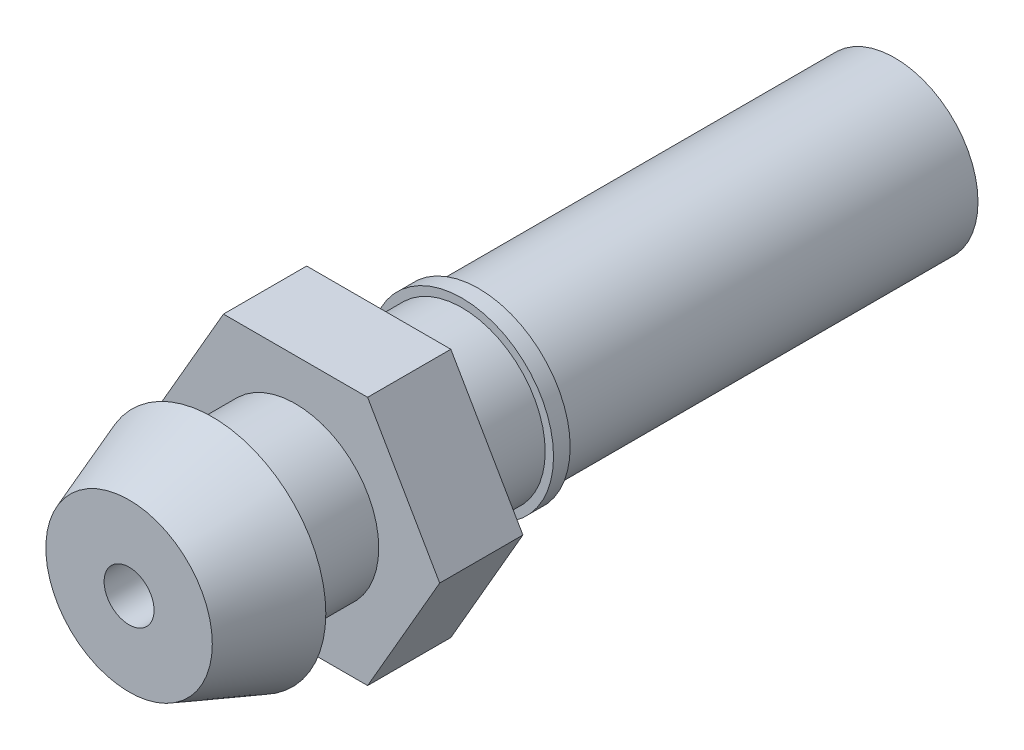
ISO-10303-21;
HEADER;
FILE_DESCRIPTION(('STEP AP214'),'2;1');
FILE_NAME('part.step','',(''),(''),'','','');
FILE_SCHEMA(('AUTOMOTIVE_DESIGN { 1 0 10303 214 1 1 1 1 }'));
ENDSEC;
DATA;
#1=APPLICATION_CONTEXT('core data for automotive mechanical design processes');
#2=APPLICATION_PROTOCOL_DEFINITION('international standard','automotive_design',2000,#1);
#3=PRODUCT_CONTEXT('',#1,'mechanical');
#4=PRODUCT('Part','Part','',(#3));
#5=PRODUCT_RELATED_PRODUCT_CATEGORY('part','',(#4));
#6=PRODUCT_DEFINITION_FORMATION('','',#4);
#7=PRODUCT_DEFINITION_CONTEXT('part definition',#1,'design');
#8=PRODUCT_DEFINITION('design','',#6,#7);
#9=PRODUCT_DEFINITION_SHAPE('','',#8);
#10=(LENGTH_UNIT() NAMED_UNIT(*) SI_UNIT(.MILLI.,.METRE.));
#11=(NAMED_UNIT(*) PLANE_ANGLE_UNIT() SI_UNIT($,.RADIAN.));
#12=(NAMED_UNIT(*) SI_UNIT($,.STERADIAN.) SOLID_ANGLE_UNIT());
#13=UNCERTAINTY_MEASURE_WITH_UNIT(LENGTH_MEASURE(1.E-05),#10,'distance_accuracy_value','');
#14=(GEOMETRIC_REPRESENTATION_CONTEXT(3) GLOBAL_UNCERTAINTY_ASSIGNED_CONTEXT((#13)) GLOBAL_UNIT_ASSIGNED_CONTEXT((#10,
#11,#12)) REPRESENTATION_CONTEXT('',''));
#15=CARTESIAN_POINT('',(0.,0.,0.));
#16=DIRECTION('',(0.,0.,1.));
#17=DIRECTION('',(1.,0.,0.));
#18=AXIS2_PLACEMENT_3D('',#15,#16,#17);
#19=CARTESIAN_POINT('',(0.,0.,11.684));
#20=DIRECTION('',(0.,0.,-1.));
#21=DIRECTION('',(1.,0.,0.));
#22=AXIS2_PLACEMENT_3D('',#19,#20,#21);
#23=CONICAL_SURFACE('',#22,1.27,0.349065850398867);
#24=CARTESIAN_POINT('',(0.,0.,11.684));
#25=DIRECTION('',(0.,0.,1.));
#26=DIRECTION('',(1.,0.,0.));
#27=AXIS2_PLACEMENT_3D('',#24,#25,#26);
#28=CIRCLE('',#27,1.27);
#29=CARTESIAN_POINT('',(1.27,0.,11.684));
#30=VERTEX_POINT('',#29);
#31=EDGE_CURVE('E11',#30,#30,#28,.T.);
#32=ORIENTED_EDGE('',*,*,#31,.F.);
#33=EDGE_LOOP('',(#32));
#34=FACE_BOUND('',#33,.T.);
#35=CARTESIAN_POINT('',(0.,0.,10.414));
#36=DIRECTION('',(0.,0.,1.));
#37=DIRECTION('',(1.,0.,0.));
#38=AXIS2_PLACEMENT_3D('',#35,#36,#37);
#39=CIRCLE('',#38,1.73224219751808);
#40=CARTESIAN_POINT('',(1.73224219751808,0.,10.414));
#41=VERTEX_POINT('',#40);
#42=EDGE_CURVE('E47',#41,#41,#39,.T.);
#43=ORIENTED_EDGE('',*,*,#42,.T.);
#44=EDGE_LOOP('',(#43));
#45=FACE_BOUND('',#44,.T.);
#46=ADVANCED_FACE('F40',(#34,#45),#23,.T.);
#47=CARTESIAN_POINT('',(0.,0.,11.684));
#48=DIRECTION('',(0.,0.,1.));
#49=DIRECTION('',(1.,0.,0.));
#50=AXIS2_PLACEMENT_3D('',#47,#48,#49);
#51=PLANE('',#50);
#52=CARTESIAN_POINT('',(0.,0.,11.684));
#53=DIRECTION('',(0.,0.,1.));
#54=DIRECTION('',(1.,0.,0.));
#55=AXIS2_PLACEMENT_3D('',#52,#53,#54);
#56=CIRCLE('',#55,0.381);
#57=CARTESIAN_POINT('',(0.381,0.,11.684));
#58=VERTEX_POINT('',#57);
#59=EDGE_CURVE('E53',#58,#58,#56,.T.);
#60=ORIENTED_EDGE('',*,*,#59,.F.);
#61=EDGE_LOOP('',(#60));
#62=FACE_BOUND('',#61,.T.);
#63=ORIENTED_EDGE('',*,*,#31,.T.);
#64=EDGE_LOOP('',(#63));
#65=FACE_BOUND('',#64,.T.);
#66=ADVANCED_FACE('F69',(#62,#65),#51,.T.);
#67=CARTESIAN_POINT('',(0.,0.,10.414));
#68=DIRECTION('',(0.,0.,1.));
#69=DIRECTION('',(1.,0.,0.));
#70=AXIS2_PLACEMENT_3D('',#67,#68,#69);
#71=PLANE('',#70);
#72=CARTESIAN_POINT('',(0.,0.,10.414));
#73=DIRECTION('',(0.,0.,1.));
#74=DIRECTION('',(1.,0.,0.));
#75=AXIS2_PLACEMENT_3D('',#72,#73,#74);
#76=CIRCLE('',#75,0.381);
#77=CARTESIAN_POINT('',(0.381,0.,10.414));
#78=VERTEX_POINT('',#77);
#79=EDGE_CURVE('E43',#78,#78,#76,.T.);
#80=ORIENTED_EDGE('',*,*,#79,.T.);
#81=EDGE_LOOP('',(#80));
#82=FACE_BOUND('',#81,.T.);
#83=ORIENTED_EDGE('',*,*,#42,.F.);
#84=EDGE_LOOP('',(#83));
#85=FACE_BOUND('',#84,.T.);
#86=ADVANCED_FACE('F60',(#82,#85),#71,.F.);
#87=CARTESIAN_POINT('',(0.,0.,0.));
#88=DIRECTION('',(0.,0.,1.));
#89=DIRECTION('',(1.,0.,0.));
#90=AXIS2_PLACEMENT_3D('',#87,#88,#89);
#91=CYLINDRICAL_SURFACE('',#90,0.381);
#92=ORIENTED_EDGE('',*,*,#59,.T.);
#93=EDGE_LOOP('',(#92));
#94=FACE_BOUND('',#93,.T.);
#95=ORIENTED_EDGE('',*,*,#79,.F.);
#96=EDGE_LOOP('',(#95));
#97=FACE_BOUND('',#96,.T.);
#98=ADVANCED_FACE('F63',(#94,#97),#91,.F.);
#99=CLOSED_SHELL('',(#46,#66,#86,#98));
#100=MANIFOLD_SOLID_BREP('B2',#99);
#101=CARTESIAN_POINT('',(0.,0.,9.144));
#102=DIRECTION('',(0.,0.,1.));
#103=DIRECTION('',(1.,0.,0.));
#104=AXIS2_PLACEMENT_3D('',#101,#102,#103);
#105=PLANE('',#104);
#106=DIRECTION('',(0.5,0.866025403784439,0.));
#107=VECTOR('',#106,1.);
#108=CARTESIAN_POINT('',(1.09985226280624,-1.905,9.144));
#109=LINE('',#108,#107);
#110=CARTESIAN_POINT('',(1.09985226280624,-1.905,9.144));
#111=VERTEX_POINT('',#110);
#112=CARTESIAN_POINT('',(2.19970452561247,0.,9.144));
#113=VERTEX_POINT('',#112);
#114=EDGE_CURVE('E200',#111,#113,#109,.T.);
#115=ORIENTED_EDGE('',*,*,#114,.T.);
#116=DIRECTION('',(-0.5,0.866025403784439,0.));
#117=VECTOR('',#116,1.);
#118=CARTESIAN_POINT('',(2.19970452561247,0.,9.144));
#119=LINE('',#118,#117);
#120=CARTESIAN_POINT('',(1.09985226280624,1.905,9.144));
#121=VERTEX_POINT('',#120);
#122=EDGE_CURVE('E158',#113,#121,#119,.T.);
#123=ORIENTED_EDGE('',*,*,#122,.T.);
#124=DIRECTION('',(-1.,0.,0.));
#125=VECTOR('',#124,1.);
#126=CARTESIAN_POINT('',(1.09985226280624,1.905,9.144));
#127=LINE('',#126,#125);
#128=CARTESIAN_POINT('',(-1.09985226280624,1.905,9.144));
#129=VERTEX_POINT('',#128);
#130=EDGE_CURVE('E171',#121,#129,#127,.T.);
#131=ORIENTED_EDGE('',*,*,#130,.T.);
#132=DIRECTION('',(-0.5,-0.866025403784439,0.));
#133=VECTOR('',#132,1.);
#134=CARTESIAN_POINT('',(-1.09985226280624,1.905,9.144));
#135=LINE('',#134,#133);
#136=CARTESIAN_POINT('',(-2.19970452561247,0.,9.144));
#137=VERTEX_POINT('',#136);
#138=EDGE_CURVE('E165',#129,#137,#135,.T.);
#139=ORIENTED_EDGE('',*,*,#138,.T.);
#140=DIRECTION('',(0.5,-0.866025403784439,0.));
#141=VECTOR('',#140,1.);
#142=CARTESIAN_POINT('',(-2.19970452561247,0.,9.144));
#143=LINE('',#142,#141);
#144=CARTESIAN_POINT('',(-1.09985226280624,-1.905,9.144));
#145=VERTEX_POINT('',#144);
#146=EDGE_CURVE('E169',#137,#145,#143,.T.);
#147=ORIENTED_EDGE('',*,*,#146,.T.);
#148=DIRECTION('',(1.,0.,0.));
#149=VECTOR('',#148,1.);
#150=CARTESIAN_POINT('',(-1.09985226280624,-1.905,9.144));
#151=LINE('',#150,#149);
#152=EDGE_CURVE('E120',#145,#111,#151,.T.);
#153=ORIENTED_EDGE('',*,*,#152,.T.);
#154=EDGE_LOOP('',(#115,#123,#131,#139,#147,#153));
#155=FACE_BOUND('',#154,.T.);
#156=CARTESIAN_POINT('',(0.,0.,9.144));
#157=DIRECTION('',(0.,0.,1.));
#158=DIRECTION('',(1.,0.,0.));
#159=AXIS2_PLACEMENT_3D('',#156,#157,#158);
#160=CIRCLE('',#159,1.27);
#161=CARTESIAN_POINT('',(1.27,0.,9.144));
#162=VERTEX_POINT('',#161);
#163=EDGE_CURVE('E398',#162,#162,#160,.T.);
#164=ORIENTED_EDGE('',*,*,#163,.F.);
#165=EDGE_LOOP('',(#164));
#166=FACE_BOUND('',#165,.T.);
#167=ADVANCED_FACE('F101',(#155,#166),#105,.T.);
#168=CARTESIAN_POINT('',(0.,0.,6.604));
#169=DIRECTION('',(0.,0.,1.));
#170=DIRECTION('',(1.,0.,0.));
#171=AXIS2_PLACEMENT_3D('',#168,#169,#170);
#172=PLANE('',#171);
#173=CARTESIAN_POINT('',(0.,0.,6.604));
#174=DIRECTION('',(0.,0.,1.));
#175=DIRECTION('',(1.,0.,0.));
#176=AXIS2_PLACEMENT_3D('',#173,#174,#175);
#177=CIRCLE('',#176,1.397);
#178=CARTESIAN_POINT('',(1.397,0.,6.604));
#179=VERTEX_POINT('',#178);
#180=EDGE_CURVE('E216',#179,#179,#177,.T.);
#181=ORIENTED_EDGE('',*,*,#180,.T.);
#182=EDGE_LOOP('',(#181));
#183=FACE_BOUND('',#182,.T.);
#184=CARTESIAN_POINT('',(0.,0.,6.604));
#185=DIRECTION('',(0.,0.,1.));
#186=DIRECTION('',(1.,0.,0.));
#187=AXIS2_PLACEMENT_3D('',#184,#185,#186);
#188=CIRCLE('',#187,1.27);
#189=CARTESIAN_POINT('',(1.27,0.,6.604));
#190=VERTEX_POINT('',#189);
#191=EDGE_CURVE('E209',#190,#190,#188,.T.);
#192=ORIENTED_EDGE('',*,*,#191,.F.);
#193=EDGE_LOOP('',(#192));
#194=FACE_BOUND('',#193,.T.);
#195=ADVANCED_FACE('F235',(#183,#194),#172,.T.);
#196=CARTESIAN_POINT('',(0.,0.,6.35));
#197=DIRECTION('',(0.,0.,-1.));
#198=DIRECTION('',(-1.,0.,0.));
#199=AXIS2_PLACEMENT_3D('',#196,#197,#198);
#200=CYLINDRICAL_SURFACE('',#199,1.27);
#201=CARTESIAN_POINT('',(0.,0.,6.35));
#202=DIRECTION('',(0.,0.,1.));
#203=DIRECTION('',(1.,0.,0.));
#204=AXIS2_PLACEMENT_3D('',#201,#202,#203);
#205=CIRCLE('',#204,1.27);
#206=CARTESIAN_POINT('',(1.27,0.,6.35));
#207=VERTEX_POINT('',#206);
#208=EDGE_CURVE('E38',#207,#207,#205,.T.);
#209=ORIENTED_EDGE('',*,*,#208,.F.);
#210=EDGE_LOOP('',(#209));
#211=FACE_BOUND('',#210,.T.);
#212=CARTESIAN_POINT('',(0.,0.,0.));
#213=DIRECTION('',(0.,0.,1.));
#214=DIRECTION('',(1.,0.,0.));
#215=AXIS2_PLACEMENT_3D('',#212,#213,#214);
#216=CIRCLE('',#215,1.27);
#217=CARTESIAN_POINT('',(1.27,0.,0.));
#218=VERTEX_POINT('',#217);
#219=EDGE_CURVE('E111',#218,#218,#216,.T.);
#220=ORIENTED_EDGE('',*,*,#219,.T.);
#221=EDGE_LOOP('',(#220));
#222=FACE_BOUND('',#221,.T.);
#223=ADVANCED_FACE('F103',(#211,#222),#200,.T.);
#224=CARTESIAN_POINT('',(0.,0.,0.));
#225=DIRECTION('',(0.,0.,1.));
#226=DIRECTION('',(1.,0.,0.));
#227=AXIS2_PLACEMENT_3D('',#224,#225,#226);
#228=PLANE('',#227);
#229=CARTESIAN_POINT('',(0.,0.,0.));
#230=DIRECTION('',(0.,0.,1.));
#231=DIRECTION('',(1.,0.,0.));
#232=AXIS2_PLACEMENT_3D('',#229,#230,#231);
#233=CIRCLE('',#232,0.381);
#234=CARTESIAN_POINT('',(0.381,0.,0.));
#235=VERTEX_POINT('',#234);
#236=EDGE_CURVE('E396',#235,#235,#233,.T.);
#237=ORIENTED_EDGE('',*,*,#236,.T.);
#238=EDGE_LOOP('',(#237));
#239=FACE_BOUND('',#238,.T.);
#240=ORIENTED_EDGE('',*,*,#219,.F.);
#241=EDGE_LOOP('',(#240));
#242=FACE_BOUND('',#241,.T.);
#243=ADVANCED_FACE('F224',(#239,#242),#228,.F.);
#244=CARTESIAN_POINT('',(0.,0.,6.35));
#245=DIRECTION('',(0.,0.,1.));
#246=DIRECTION('',(1.,0.,0.));
#247=AXIS2_PLACEMENT_3D('',#244,#245,#246);
#248=PLANE('',#247);
#249=CARTESIAN_POINT('',(0.,0.,6.35));
#250=DIRECTION('',(0.,0.,1.));
#251=DIRECTION('',(1.,0.,0.));
#252=AXIS2_PLACEMENT_3D('',#249,#250,#251);
#253=CIRCLE('',#252,1.397);
#254=CARTESIAN_POINT('',(1.397,0.,6.35));
#255=VERTEX_POINT('',#254);
#256=EDGE_CURVE('E213',#255,#255,#253,.T.);
#257=ORIENTED_EDGE('',*,*,#256,.F.);
#258=EDGE_LOOP('',(#257));
#259=FACE_BOUND('',#258,.T.);
#260=ORIENTED_EDGE('',*,*,#208,.T.);
#261=EDGE_LOOP('',(#260));
#262=FACE_BOUND('',#261,.T.);
#263=ADVANCED_FACE('F226',(#259,#262),#248,.F.);
#264=CARTESIAN_POINT('',(0.,0.,6.604));
#265=DIRECTION('',(0.,0.,-1.));
#266=DIRECTION('',(-1.,0.,0.));
#267=AXIS2_PLACEMENT_3D('',#264,#265,#266);
#268=CYLINDRICAL_SURFACE('',#267,1.397);
#269=ORIENTED_EDGE('',*,*,#180,.F.);
#270=EDGE_LOOP('',(#269));
#271=FACE_BOUND('',#270,.T.);
#272=ORIENTED_EDGE('',*,*,#256,.T.);
#273=EDGE_LOOP('',(#272));
#274=FACE_BOUND('',#273,.T.);
#275=ADVANCED_FACE('F232',(#271,#274),#268,.T.);
#276=CARTESIAN_POINT('',(0.,0.,7.874));
#277=DIRECTION('',(0.,0.,-1.));
#278=DIRECTION('',(-1.,0.,0.));
#279=AXIS2_PLACEMENT_3D('',#276,#277,#278);
#280=CYLINDRICAL_SURFACE('',#279,1.27);
#281=CARTESIAN_POINT('',(0.,0.,7.874));
#282=DIRECTION('',(0.,0.,1.));
#283=DIRECTION('',(1.,0.,0.));
#284=AXIS2_PLACEMENT_3D('',#281,#282,#283);
#285=CIRCLE('',#284,1.27);
#286=CARTESIAN_POINT('',(1.27,0.,7.874));
#287=VERTEX_POINT('',#286);
#288=EDGE_CURVE('E210',#287,#287,#285,.T.);
#289=ORIENTED_EDGE('',*,*,#288,.F.);
#290=EDGE_LOOP('',(#289));
#291=FACE_BOUND('',#290,.T.);
#292=ORIENTED_EDGE('',*,*,#191,.T.);
#293=EDGE_LOOP('',(#292));
#294=FACE_BOUND('',#293,.T.);
#295=ADVANCED_FACE('F254',(#291,#294),#280,.T.);
#296=CARTESIAN_POINT('',(0.,0.,7.874));
#297=DIRECTION('',(0.,0.,1.));
#298=DIRECTION('',(1.,0.,0.));
#299=AXIS2_PLACEMENT_3D('',#296,#297,#298);
#300=PLANE('',#299);
#301=DIRECTION('',(0.5,0.866025403784439,0.));
#302=VECTOR('',#301,1.);
#303=CARTESIAN_POINT('',(1.09985226280624,-1.905,7.874));
#304=LINE('',#303,#302);
#305=CARTESIAN_POINT('',(1.09985226280624,-1.905,7.874));
#306=VERTEX_POINT('',#305);
#307=CARTESIAN_POINT('',(2.19970452561247,0.,7.874));
#308=VERTEX_POINT('',#307);
#309=EDGE_CURVE('E189',#306,#308,#304,.T.);
#310=ORIENTED_EDGE('',*,*,#309,.F.);
#311=DIRECTION('',(1.,0.,0.));
#312=VECTOR('',#311,1.);
#313=CARTESIAN_POINT('',(-1.09985226280624,-1.905,7.874));
#314=LINE('',#313,#312);
#315=CARTESIAN_POINT('',(-1.09985226280624,-1.905,7.874));
#316=VERTEX_POINT('',#315);
#317=EDGE_CURVE('E149',#316,#306,#314,.T.);
#318=ORIENTED_EDGE('',*,*,#317,.F.);
#319=DIRECTION('',(0.5,-0.866025403784439,0.));
#320=VECTOR('',#319,1.);
#321=CARTESIAN_POINT('',(-2.19970452561247,0.,7.874));
#322=LINE('',#321,#320);
#323=CARTESIAN_POINT('',(-2.19970452561247,0.,7.874));
#324=VERTEX_POINT('',#323);
#325=EDGE_CURVE('E143',#324,#316,#322,.T.);
#326=ORIENTED_EDGE('',*,*,#325,.F.);
#327=DIRECTION('',(-0.5,-0.866025403784439,0.));
#328=VECTOR('',#327,1.);
#329=CARTESIAN_POINT('',(-1.09985226280624,1.905,7.874));
#330=LINE('',#329,#328);
#331=CARTESIAN_POINT('',(-1.09985226280624,1.905,7.874));
#332=VERTEX_POINT('',#331);
#333=EDGE_CURVE('E179',#332,#324,#330,.T.);
#334=ORIENTED_EDGE('',*,*,#333,.F.);
#335=DIRECTION('',(-1.,0.,0.));
#336=VECTOR('',#335,1.);
#337=CARTESIAN_POINT('',(1.09985226280624,1.905,7.874));
#338=LINE('',#337,#336);
#339=CARTESIAN_POINT('',(1.09985226280624,1.905,7.874));
#340=VERTEX_POINT('',#339);
#341=EDGE_CURVE('E195',#340,#332,#338,.T.);
#342=ORIENTED_EDGE('',*,*,#341,.F.);
#343=DIRECTION('',(-0.5,0.866025403784439,0.));
#344=VECTOR('',#343,1.);
#345=CARTESIAN_POINT('',(2.19970452561247,0.,7.874));
#346=LINE('',#345,#344);
#347=EDGE_CURVE('E192',#308,#340,#346,.T.);
#348=ORIENTED_EDGE('',*,*,#347,.F.);
#349=EDGE_LOOP('',(#310,#318,#326,#334,#342,#348));
#350=FACE_BOUND('',#349,.T.);
#351=ORIENTED_EDGE('',*,*,#288,.T.);
#352=EDGE_LOOP('',(#351));
#353=FACE_BOUND('',#352,.T.);
#354=ADVANCED_FACE('F250',(#350,#353),#300,.F.);
#355=CARTESIAN_POINT('',(1.09985226280624,-1.905,9.144));
#356=DIRECTION('',(-0.866025403784439,0.5,0.));
#357=DIRECTION('',(-0.5,-0.866025403784439,0.));
#358=AXIS2_PLACEMENT_3D('',#355,#356,#357);
#359=PLANE('',#358);
#360=ORIENTED_EDGE('',*,*,#309,.T.);
#361=DIRECTION('',(0.,0.,-1.));
#362=VECTOR('',#361,1.);
#363=CARTESIAN_POINT('',(2.19970452561247,0.,9.144));
#364=LINE('',#363,#362);
#365=EDGE_CURVE('E207',#113,#308,#364,.T.);
#366=ORIENTED_EDGE('',*,*,#365,.F.);
#367=ORIENTED_EDGE('',*,*,#114,.F.);
#368=DIRECTION('',(0.,0.,-1.));
#369=VECTOR('',#368,1.);
#370=CARTESIAN_POINT('',(1.09985226280624,-1.905,9.144));
#371=LINE('',#370,#369);
#372=EDGE_CURVE('E185',#111,#306,#371,.T.);
#373=ORIENTED_EDGE('',*,*,#372,.T.);
#374=EDGE_LOOP('',(#360,#366,#367,#373));
#375=FACE_BOUND('',#374,.T.);
#376=ADVANCED_FACE('F253',(#375),#359,.F.);
#377=CARTESIAN_POINT('',(2.19970452561247,0.,9.144));
#378=DIRECTION('',(-0.866025403784438,-0.5,0.));
#379=DIRECTION('',(0.5,-0.866025403784439,0.));
#380=AXIS2_PLACEMENT_3D('',#377,#378,#379);
#381=PLANE('',#380);
#382=ORIENTED_EDGE('',*,*,#347,.T.);
#383=DIRECTION('',(0.,0.,-1.));
#384=VECTOR('',#383,1.);
#385=CARTESIAN_POINT('',(1.09985226280624,1.905,9.144));
#386=LINE('',#385,#384);
#387=EDGE_CURVE('E204',#121,#340,#386,.T.);
#388=ORIENTED_EDGE('',*,*,#387,.F.);
#389=ORIENTED_EDGE('',*,*,#122,.F.);
#390=ORIENTED_EDGE('',*,*,#365,.T.);
#391=EDGE_LOOP('',(#382,#388,#389,#390));
#392=FACE_BOUND('',#391,.T.);
#393=ADVANCED_FACE('F266',(#392),#381,.F.);
#394=CARTESIAN_POINT('',(1.09985226280624,1.905,9.144));
#395=DIRECTION('',(0.,-1.,0.));
#396=DIRECTION('',(1.,0.,0.));
#397=AXIS2_PLACEMENT_3D('',#394,#395,#396);
#398=PLANE('',#397);
#399=ORIENTED_EDGE('',*,*,#341,.T.);
#400=DIRECTION('',(0.,0.,-1.));
#401=VECTOR('',#400,1.);
#402=CARTESIAN_POINT('',(-1.09985226280624,1.905,9.144));
#403=LINE('',#402,#401);
#404=EDGE_CURVE('E180',#129,#332,#403,.T.);
#405=ORIENTED_EDGE('',*,*,#404,.F.);
#406=ORIENTED_EDGE('',*,*,#130,.F.);
#407=ORIENTED_EDGE('',*,*,#387,.T.);
#408=EDGE_LOOP('',(#399,#405,#406,#407));
#409=FACE_BOUND('',#408,.T.);
#410=ADVANCED_FACE('F263',(#409),#398,.F.);
#411=CARTESIAN_POINT('',(-1.09985226280624,1.905,9.144));
#412=DIRECTION('',(0.866025403784439,-0.5,0.));
#413=DIRECTION('',(0.5,0.866025403784439,0.));
#414=AXIS2_PLACEMENT_3D('',#411,#412,#413);
#415=PLANE('',#414);
#416=ORIENTED_EDGE('',*,*,#333,.T.);
#417=DIRECTION('',(0.,0.,-1.));
#418=VECTOR('',#417,1.);
#419=CARTESIAN_POINT('',(-2.19970452561247,0.,9.144));
#420=LINE('',#419,#418);
#421=EDGE_CURVE('E176',#137,#324,#420,.T.);
#422=ORIENTED_EDGE('',*,*,#421,.F.);
#423=ORIENTED_EDGE('',*,*,#138,.F.);
#424=ORIENTED_EDGE('',*,*,#404,.T.);
#425=EDGE_LOOP('',(#416,#422,#423,#424));
#426=FACE_BOUND('',#425,.T.);
#427=ADVANCED_FACE('F177',(#426),#415,.F.);
#428=CARTESIAN_POINT('',(-2.19970452561247,0.,9.144));
#429=DIRECTION('',(0.866025403784439,0.5,0.));
#430=DIRECTION('',(-0.5,0.866025403784439,0.));
#431=AXIS2_PLACEMENT_3D('',#428,#429,#430);
#432=PLANE('',#431);
#433=ORIENTED_EDGE('',*,*,#325,.T.);
#434=DIRECTION('',(0.,0.,-1.));
#435=VECTOR('',#434,1.);
#436=CARTESIAN_POINT('',(-1.09985226280624,-1.905,9.144));
#437=LINE('',#436,#435);
#438=EDGE_CURVE('E181',#145,#316,#437,.T.);
#439=ORIENTED_EDGE('',*,*,#438,.F.);
#440=ORIENTED_EDGE('',*,*,#146,.F.);
#441=ORIENTED_EDGE('',*,*,#421,.T.);
#442=EDGE_LOOP('',(#433,#439,#440,#441));
#443=FACE_BOUND('',#442,.T.);
#444=ADVANCED_FACE('F183',(#443),#432,.F.);
#445=CARTESIAN_POINT('',(-1.09985226280624,-1.905,9.144));
#446=DIRECTION('',(0.,1.,0.));
#447=DIRECTION('',(0.,0.,1.));
#448=AXIS2_PLACEMENT_3D('',#445,#446,#447);
#449=PLANE('',#448);
#450=ORIENTED_EDGE('',*,*,#317,.T.);
#451=ORIENTED_EDGE('',*,*,#372,.F.);
#452=ORIENTED_EDGE('',*,*,#152,.F.);
#453=ORIENTED_EDGE('',*,*,#438,.T.);
#454=EDGE_LOOP('',(#450,#451,#452,#453));
#455=FACE_BOUND('',#454,.T.);
#456=ADVANCED_FACE('F256',(#455),#449,.F.);
#457=CARTESIAN_POINT('',(0.,0.,10.414));
#458=DIRECTION('',(0.,0.,-1.));
#459=DIRECTION('',(-1.,0.,0.));
#460=AXIS2_PLACEMENT_3D('',#457,#458,#459);
#461=CYLINDRICAL_SURFACE('',#460,1.27);
#462=CARTESIAN_POINT('',(0.,0.,10.414));
#463=DIRECTION('',(0.,0.,1.));
#464=DIRECTION('',(1.,0.,0.));
#465=AXIS2_PLACEMENT_3D('',#462,#463,#464);
#466=CIRCLE('',#465,1.27);
#467=CARTESIAN_POINT('',(1.27,0.,10.414));
#468=VERTEX_POINT('',#467);
#469=EDGE_CURVE('E193',#468,#468,#466,.T.);
#470=ORIENTED_EDGE('',*,*,#469,.F.);
#471=EDGE_LOOP('',(#470));
#472=FACE_BOUND('',#471,.T.);
#473=ORIENTED_EDGE('',*,*,#163,.T.);
#474=EDGE_LOOP('',(#473));
#475=FACE_BOUND('',#474,.T.);
#476=ADVANCED_FACE('F248',(#472,#475),#461,.T.);
#477=CARTESIAN_POINT('',(0.,0.,10.414));
#478=DIRECTION('',(0.,0.,1.));
#479=DIRECTION('',(1.,0.,0.));
#480=AXIS2_PLACEMENT_3D('',#477,#478,#479);
#481=PLANE('',#480);
#482=CARTESIAN_POINT('',(0.,0.,10.414));
#483=DIRECTION('',(0.,0.,1.));
#484=DIRECTION('',(1.,0.,0.));
#485=AXIS2_PLACEMENT_3D('',#482,#483,#484);
#486=CIRCLE('',#485,0.381);
#487=CARTESIAN_POINT('',(0.381,0.,10.414));
#488=VERTEX_POINT('',#487);
#489=EDGE_CURVE('E105',#488,#488,#486,.T.);
#490=ORIENTED_EDGE('',*,*,#489,.F.);
#491=EDGE_LOOP('',(#490));
#492=FACE_BOUND('',#491,.T.);
#493=ORIENTED_EDGE('',*,*,#469,.T.);
#494=EDGE_LOOP('',(#493));
#495=FACE_BOUND('',#494,.T.);
#496=ADVANCED_FACE('F328',(#492,#495),#481,.T.);
#497=CARTESIAN_POINT('',(0.,0.,0.));
#498=DIRECTION('',(0.,0.,1.));
#499=DIRECTION('',(1.,0.,0.));
#500=AXIS2_PLACEMENT_3D('',#497,#498,#499);
#501=CYLINDRICAL_SURFACE('',#500,0.381);
#502=ORIENTED_EDGE('',*,*,#489,.T.);
#503=EDGE_LOOP('',(#502));
#504=FACE_BOUND('',#503,.T.);
#505=ORIENTED_EDGE('',*,*,#236,.F.);
#506=EDGE_LOOP('',(#505));
#507=FACE_BOUND('',#506,.T.);
#508=ADVANCED_FACE('F335',(#504,#507),#501,.F.);
#509=CLOSED_SHELL('',(#167,#195,#223,#243,#263,#275,#295,#354,#376,#393,#410,#427,#444,#456,
#476,#496,#508));
#510=MANIFOLD_SOLID_BREP('B6',#509);
#511=ADVANCED_BREP_SHAPE_REPRESENTATION('',(#18,#100,#510),#14);
#512=SHAPE_DEFINITION_REPRESENTATION(#9,#511);
ENDSEC;
END-ISO-10303-21;
